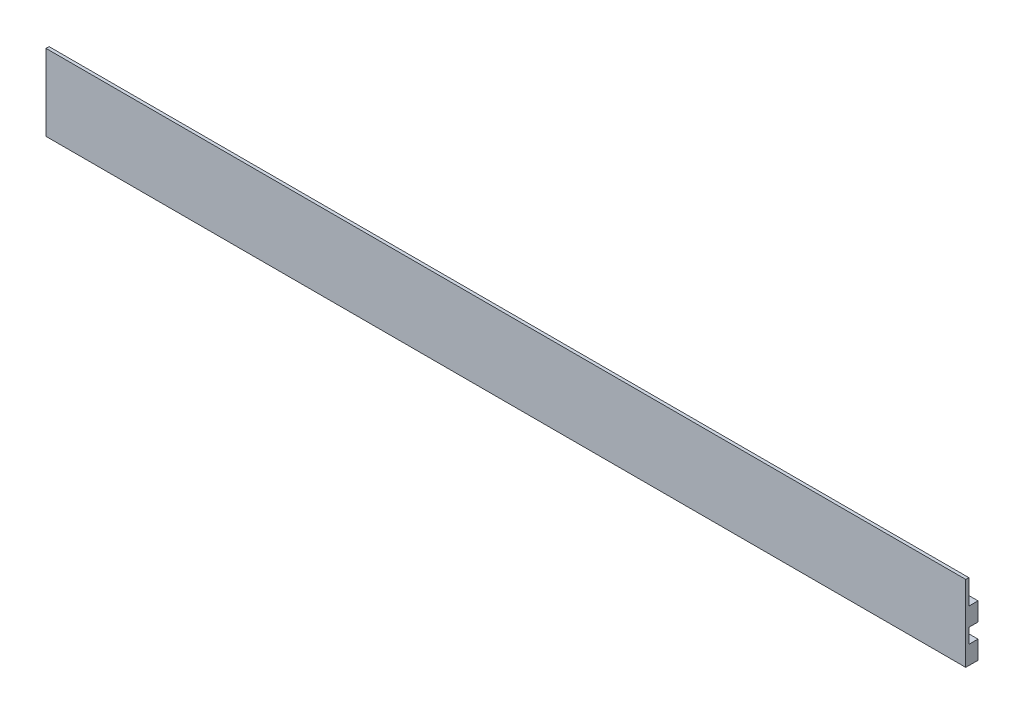
ISO-10303-21;
HEADER;
FILE_DESCRIPTION(('STEP AP214'),'2;1');
FILE_NAME('part.step','',(''),(''),'','','');
FILE_SCHEMA(('AUTOMOTIVE_DESIGN { 1 0 10303 214 1 1 1 1 }'));
ENDSEC;
DATA;
#1=APPLICATION_CONTEXT('core data for automotive mechanical design processes');
#2=APPLICATION_PROTOCOL_DEFINITION('international standard','automotive_design',2000,#1);
#3=PRODUCT_CONTEXT('',#1,'mechanical');
#4=PRODUCT('Part','Part','',(#3));
#5=PRODUCT_RELATED_PRODUCT_CATEGORY('part','',(#4));
#6=PRODUCT_DEFINITION_FORMATION('','',#4);
#7=PRODUCT_DEFINITION_CONTEXT('part definition',#1,'design');
#8=PRODUCT_DEFINITION('design','',#6,#7);
#9=PRODUCT_DEFINITION_SHAPE('','',#8);
#10=(LENGTH_UNIT() NAMED_UNIT(*) SI_UNIT(.MILLI.,.METRE.));
#11=(NAMED_UNIT(*) PLANE_ANGLE_UNIT() SI_UNIT($,.RADIAN.));
#12=(NAMED_UNIT(*) SI_UNIT($,.STERADIAN.) SOLID_ANGLE_UNIT());
#13=UNCERTAINTY_MEASURE_WITH_UNIT(LENGTH_MEASURE(1.E-05),#10,'distance_accuracy_value','');
#14=(GEOMETRIC_REPRESENTATION_CONTEXT(3) GLOBAL_UNCERTAINTY_ASSIGNED_CONTEXT((#13)) GLOBAL_UNIT_ASSIGNED_CONTEXT((#10,
#11,#12)) REPRESENTATION_CONTEXT('',''));
#15=CARTESIAN_POINT('',(0.,0.,0.));
#16=DIRECTION('',(0.,0.,1.));
#17=DIRECTION('',(1.,0.,0.));
#18=AXIS2_PLACEMENT_3D('',#15,#16,#17);
#19=CARTESIAN_POINT('',(0.,0.,-5.));
#20=DIRECTION('',(0.,0.,1.));
#21=DIRECTION('',(1.,0.,0.));
#22=AXIS2_PLACEMENT_3D('',#19,#20,#21);
#23=PLANE('',#22);
#24=DIRECTION('',(1.,0.,0.));
#25=VECTOR('',#24,1.);
#26=CARTESIAN_POINT('',(-1500.,361.346620116079,-5.));
#27=LINE('',#26,#25);
#28=CARTESIAN_POINT('',(-1500.,361.346620116079,-5.));
#29=VERTEX_POINT('',#28);
#30=CARTESIAN_POINT('',(1500.,361.346620116078,-5.));
#31=VERTEX_POINT('',#30);
#32=EDGE_CURVE('E133',#29,#31,#27,.T.);
#33=ORIENTED_EDGE('',*,*,#32,.F.);
#34=DIRECTION('',(0.,-1.,0.));
#35=VECTOR('',#34,1.);
#36=CARTESIAN_POINT('',(-1500.,-550.,-5.));
#37=LINE('',#36,#35);
#38=CARTESIAN_POINT('',(-1500.,409.471551706816,-5.));
#39=VERTEX_POINT('',#38);
#40=EDGE_CURVE('E153',#39,#29,#37,.T.);
#41=ORIENTED_EDGE('',*,*,#40,.F.);
#42=DIRECTION('',(-1.,0.,0.));
#43=VECTOR('',#42,1.);
#44=CARTESIAN_POINT('',(-1500.,409.471551706816,-5.));
#45=LINE('',#44,#43);
#46=CARTESIAN_POINT('',(1500.,409.471551706815,-5.));
#47=VERTEX_POINT('',#46);
#48=EDGE_CURVE('E164',#47,#39,#45,.T.);
#49=ORIENTED_EDGE('',*,*,#48,.F.);
#50=DIRECTION('',(0.,1.,0.));
#51=VECTOR('',#50,1.);
#52=CARTESIAN_POINT('',(1500.,-550.,-5.));
#53=LINE('',#52,#51);
#54=EDGE_CURVE('E143',#31,#47,#53,.T.);
#55=ORIENTED_EDGE('',*,*,#54,.F.);
#56=EDGE_LOOP('',(#33,#41,#49,#55));
#57=FACE_BOUND('',#56,.T.);
#58=ADVANCED_FACE('F37',(#57),#23,.F.);
#59=DIRECTION('',(1.,0.,0.));
#60=VECTOR('',#59,1.);
#61=CARTESIAN_POINT('',(-1500.,469.471551706816,-5.));
#62=LINE('',#61,#60);
#63=CARTESIAN_POINT('',(-1500.,469.471551706815,-5.));
#64=VERTEX_POINT('',#63);
#65=CARTESIAN_POINT('',(1500.,469.471551706815,-5.));
#66=VERTEX_POINT('',#65);
#67=EDGE_CURVE('E159',#64,#66,#62,.T.);
#68=ORIENTED_EDGE('',*,*,#67,.F.);
#69=CARTESIAN_POINT('',(-1500.,550.,-5.));
#70=VERTEX_POINT('',#69);
#71=EDGE_CURVE('E150',#70,#64,#37,.T.);
#72=ORIENTED_EDGE('',*,*,#71,.F.);
#73=DIRECTION('',(-1.,0.,0.));
#74=VECTOR('',#73,1.);
#75=CARTESIAN_POINT('',(1500.,550.,-5.));
#76=LINE('',#75,#74);
#77=CARTESIAN_POINT('',(1500.,550.,-5.));
#78=VERTEX_POINT('',#77);
#79=EDGE_CURVE('E140',#78,#70,#76,.T.);
#80=ORIENTED_EDGE('',*,*,#79,.F.);
#81=EDGE_CURVE('E60',#66,#78,#53,.T.);
#82=ORIENTED_EDGE('',*,*,#81,.F.);
#83=EDGE_LOOP('',(#68,#72,#80,#82));
#84=FACE_BOUND('',#83,.T.);
#85=ADVANCED_FACE('F158',(#84),#23,.F.);
#86=CARTESIAN_POINT('',(-1500.,-550.,5.));
#87=DIRECTION('',(1.,0.,0.));
#88=DIRECTION('',(0.,0.,-1.));
#89=AXIS2_PLACEMENT_3D('',#86,#87,#88);
#90=PLANE('',#89);
#91=DIRECTION('',(0.,0.,1.));
#92=VECTOR('',#91,1.);
#93=CARTESIAN_POINT('',(-1500.,301.346620116079,-35.));
#94=LINE('',#93,#92);
#95=CARTESIAN_POINT('',(-1500.,301.346620116079,-35.));
#96=VERTEX_POINT('',#95);
#97=CARTESIAN_POINT('',(-1500.,301.346620116079,5.));
#98=VERTEX_POINT('',#97);
#99=EDGE_CURVE('E116',#96,#98,#94,.T.);
#100=ORIENTED_EDGE('',*,*,#99,.T.);
#101=DIRECTION('',(0.,-1.,0.));
#102=VECTOR('',#101,1.);
#103=CARTESIAN_POINT('',(-1500.,-550.,5.));
#104=LINE('',#103,#102);
#105=CARTESIAN_POINT('',(-1500.,550.,5.));
#106=VERTEX_POINT('',#105);
#107=EDGE_CURVE('E120',#106,#98,#104,.T.);
#108=ORIENTED_EDGE('',*,*,#107,.F.);
#109=DIRECTION('',(0.,0.,-1.));
#110=VECTOR('',#109,1.);
#111=CARTESIAN_POINT('',(-1500.,550.,5.));
#112=LINE('',#111,#110);
#113=EDGE_CURVE('E45',#106,#70,#112,.T.);
#114=ORIENTED_EDGE('',*,*,#113,.T.);
#115=ORIENTED_EDGE('',*,*,#71,.T.);
#116=DIRECTION('',(0.,0.,1.));
#117=VECTOR('',#116,1.);
#118=CARTESIAN_POINT('',(-1500.,469.471551706816,-35.));
#119=LINE('',#118,#117);
#120=CARTESIAN_POINT('',(-1500.,469.471551706816,-35.));
#121=VERTEX_POINT('',#120);
#122=EDGE_CURVE('E175',#121,#64,#119,.T.);
#123=ORIENTED_EDGE('',*,*,#122,.F.);
#124=DIRECTION('',(0.,1.,0.));
#125=VECTOR('',#124,1.);
#126=CARTESIAN_POINT('',(-1500.,469.471551706816,-35.));
#127=LINE('',#126,#125);
#128=CARTESIAN_POINT('',(-1500.,409.471551706816,-35.));
#129=VERTEX_POINT('',#128);
#130=EDGE_CURVE('E191',#129,#121,#127,.T.);
#131=ORIENTED_EDGE('',*,*,#130,.F.);
#132=DIRECTION('',(0.,0.,1.));
#133=VECTOR('',#132,1.);
#134=CARTESIAN_POINT('',(-1500.,409.471551706816,-35.));
#135=LINE('',#134,#133);
#136=EDGE_CURVE('E177',#129,#39,#135,.T.);
#137=ORIENTED_EDGE('',*,*,#136,.T.);
#138=ORIENTED_EDGE('',*,*,#40,.T.);
#139=DIRECTION('',(0.,0.,1.));
#140=VECTOR('',#139,1.);
#141=CARTESIAN_POINT('',(-1500.,361.346620116079,-35.));
#142=LINE('',#141,#140);
#143=CARTESIAN_POINT('',(-1500.,361.346620116079,-35.));
#144=VERTEX_POINT('',#143);
#145=EDGE_CURVE('E125',#144,#29,#142,.T.);
#146=ORIENTED_EDGE('',*,*,#145,.F.);
#147=DIRECTION('',(0.,1.,0.));
#148=VECTOR('',#147,1.);
#149=CARTESIAN_POINT('',(-1500.,361.346620116079,-35.));
#150=LINE('',#149,#148);
#151=EDGE_CURVE('E122',#96,#144,#150,.T.);
#152=ORIENTED_EDGE('',*,*,#151,.F.);
#153=EDGE_LOOP('',(#100,#108,#114,#115,#123,#131,#137,#138,#146,#152));
#154=FACE_BOUND('',#153,.T.);
#155=ADVANCED_FACE('F39',(#154),#90,.F.);
#156=CARTESIAN_POINT('',(1500.,-550.,5.));
#157=DIRECTION('',(-1.,0.,0.));
#158=DIRECTION('',(0.,0.,1.));
#159=AXIS2_PLACEMENT_3D('',#156,#157,#158);
#160=PLANE('',#159);
#161=DIRECTION('',(0.,1.,0.));
#162=VECTOR('',#161,1.);
#163=CARTESIAN_POINT('',(1500.,-550.,5.));
#164=LINE('',#163,#162);
#165=CARTESIAN_POINT('',(1500.,301.346620116078,5.));
#166=VERTEX_POINT('',#165);
#167=CARTESIAN_POINT('',(1500.,550.,5.));
#168=VERTEX_POINT('',#167);
#169=EDGE_CURVE('E139',#166,#168,#164,.T.);
#170=ORIENTED_EDGE('',*,*,#169,.F.);
#171=DIRECTION('',(0.,0.,1.));
#172=VECTOR('',#171,1.);
#173=CARTESIAN_POINT('',(1500.,301.346620116078,-35.));
#174=LINE('',#173,#172);
#175=CARTESIAN_POINT('',(1500.,301.346620116078,-35.));
#176=VERTEX_POINT('',#175);
#177=EDGE_CURVE('E124',#176,#166,#174,.T.);
#178=ORIENTED_EDGE('',*,*,#177,.F.);
#179=DIRECTION('',(0.,-1.,0.));
#180=VECTOR('',#179,1.);
#181=CARTESIAN_POINT('',(1500.,361.346620116078,-35.));
#182=LINE('',#181,#180);
#183=CARTESIAN_POINT('',(1500.,361.346620116078,-35.));
#184=VERTEX_POINT('',#183);
#185=EDGE_CURVE('E202',#184,#176,#182,.T.);
#186=ORIENTED_EDGE('',*,*,#185,.F.);
#187=DIRECTION('',(0.,0.,1.));
#188=VECTOR('',#187,1.);
#189=CARTESIAN_POINT('',(1500.,361.346620116078,-35.));
#190=LINE('',#189,#188);
#191=EDGE_CURVE('E52',#184,#31,#190,.T.);
#192=ORIENTED_EDGE('',*,*,#191,.T.);
#193=ORIENTED_EDGE('',*,*,#54,.T.);
#194=DIRECTION('',(0.,0.,1.));
#195=VECTOR('',#194,1.);
#196=CARTESIAN_POINT('',(1500.,409.471551706815,-35.));
#197=LINE('',#196,#195);
#198=CARTESIAN_POINT('',(1500.,409.471551706815,-35.));
#199=VERTEX_POINT('',#198);
#200=EDGE_CURVE('E146',#199,#47,#197,.T.);
#201=ORIENTED_EDGE('',*,*,#200,.F.);
#202=DIRECTION('',(0.,-1.,0.));
#203=VECTOR('',#202,1.);
#204=CARTESIAN_POINT('',(1500.,469.471551706815,-35.));
#205=LINE('',#204,#203);
#206=CARTESIAN_POINT('',(1500.,469.471551706815,-35.));
#207=VERTEX_POINT('',#206);
#208=EDGE_CURVE('E163',#207,#199,#205,.T.);
#209=ORIENTED_EDGE('',*,*,#208,.F.);
#210=DIRECTION('',(0.,0.,1.));
#211=VECTOR('',#210,1.);
#212=CARTESIAN_POINT('',(1500.,469.471551706815,-35.));
#213=LINE('',#212,#211);
#214=EDGE_CURVE('E173',#207,#66,#213,.T.);
#215=ORIENTED_EDGE('',*,*,#214,.T.);
#216=ORIENTED_EDGE('',*,*,#81,.T.);
#217=DIRECTION('',(0.,0.,-1.));
#218=VECTOR('',#217,1.);
#219=CARTESIAN_POINT('',(1500.,550.,5.));
#220=LINE('',#219,#218);
#221=EDGE_CURVE('E11',#168,#78,#220,.T.);
#222=ORIENTED_EDGE('',*,*,#221,.F.);
#223=EDGE_LOOP('',(#170,#178,#186,#192,#193,#201,#209,#215,#216,#222));
#224=FACE_BOUND('',#223,.T.);
#225=ADVANCED_FACE('F210',(#224),#160,.F.);
#226=CARTESIAN_POINT('',(1500.,550.,5.));
#227=DIRECTION('',(0.,-1.,0.));
#228=DIRECTION('',(1.,0.,0.));
#229=AXIS2_PLACEMENT_3D('',#226,#227,#228);
#230=PLANE('',#229);
#231=ORIENTED_EDGE('',*,*,#79,.T.);
#232=ORIENTED_EDGE('',*,*,#113,.F.);
#233=DIRECTION('',(-1.,0.,0.));
#234=VECTOR('',#233,1.);
#235=CARTESIAN_POINT('',(1500.,550.,5.));
#236=LINE('',#235,#234);
#237=EDGE_CURVE('E137',#168,#106,#236,.T.);
#238=ORIENTED_EDGE('',*,*,#237,.F.);
#239=ORIENTED_EDGE('',*,*,#221,.T.);
#240=EDGE_LOOP('',(#231,#232,#238,#239));
#241=FACE_BOUND('',#240,.T.);
#242=ADVANCED_FACE('F212',(#241),#230,.F.);
#243=CARTESIAN_POINT('',(0.,0.,5.));
#244=DIRECTION('',(0.,0.,1.));
#245=DIRECTION('',(1.,0.,0.));
#246=AXIS2_PLACEMENT_3D('',#243,#244,#245);
#247=PLANE('',#246);
#248=DIRECTION('',(1.,0.,0.));
#249=VECTOR('',#248,1.);
#250=CARTESIAN_POINT('',(-1500.,301.346620116079,5.));
#251=LINE('',#250,#249);
#252=EDGE_CURVE('E128',#98,#166,#251,.T.);
#253=ORIENTED_EDGE('',*,*,#252,.T.);
#254=ORIENTED_EDGE('',*,*,#169,.T.);
#255=ORIENTED_EDGE('',*,*,#237,.T.);
#256=ORIENTED_EDGE('',*,*,#107,.T.);
#257=EDGE_LOOP('',(#253,#254,#255,#256));
#258=FACE_BOUND('',#257,.T.);
#259=ADVANCED_FACE('F135',(#258),#247,.T.);
#260=CARTESIAN_POINT('',(-1500.,409.471551706816,-35.));
#261=DIRECTION('',(0.,1.,0.));
#262=DIRECTION('',(-1.,0.,0.));
#263=AXIS2_PLACEMENT_3D('',#260,#261,#262);
#264=PLANE('',#263);
#265=ORIENTED_EDGE('',*,*,#48,.T.);
#266=ORIENTED_EDGE('',*,*,#136,.F.);
#267=DIRECTION('',(-1.,0.,0.));
#268=VECTOR('',#267,1.);
#269=CARTESIAN_POINT('',(-1500.,409.471551706816,-35.));
#270=LINE('',#269,#268);
#271=EDGE_CURVE('E167',#199,#129,#270,.T.);
#272=ORIENTED_EDGE('',*,*,#271,.F.);
#273=ORIENTED_EDGE('',*,*,#200,.T.);
#274=EDGE_LOOP('',(#265,#266,#272,#273));
#275=FACE_BOUND('',#274,.T.);
#276=ADVANCED_FACE('F190',(#275),#264,.F.);
#277=CARTESIAN_POINT('',(-1500.,469.471551706816,-35.));
#278=DIRECTION('',(0.,-1.,0.));
#279=DIRECTION('',(1.,0.,0.));
#280=AXIS2_PLACEMENT_3D('',#277,#278,#279);
#281=PLANE('',#280);
#282=ORIENTED_EDGE('',*,*,#67,.T.);
#283=ORIENTED_EDGE('',*,*,#214,.F.);
#284=DIRECTION('',(1.,0.,0.));
#285=VECTOR('',#284,1.);
#286=CARTESIAN_POINT('',(-1500.,469.471551706816,-35.));
#287=LINE('',#286,#285);
#288=EDGE_CURVE('E176',#121,#207,#287,.T.);
#289=ORIENTED_EDGE('',*,*,#288,.F.);
#290=ORIENTED_EDGE('',*,*,#122,.T.);
#291=EDGE_LOOP('',(#282,#283,#289,#290));
#292=FACE_BOUND('',#291,.T.);
#293=ADVANCED_FACE('F230',(#292),#281,.F.);
#294=CARTESIAN_POINT('',(0.,0.,-35.));
#295=DIRECTION('',(0.,0.,1.));
#296=DIRECTION('',(1.,0.,0.));
#297=AXIS2_PLACEMENT_3D('',#294,#295,#296);
#298=PLANE('',#297);
#299=ORIENTED_EDGE('',*,*,#208,.T.);
#300=ORIENTED_EDGE('',*,*,#271,.T.);
#301=ORIENTED_EDGE('',*,*,#130,.T.);
#302=ORIENTED_EDGE('',*,*,#288,.T.);
#303=EDGE_LOOP('',(#299,#300,#301,#302));
#304=FACE_BOUND('',#303,.T.);
#305=ADVANCED_FACE('F233',(#304),#298,.F.);
#306=CARTESIAN_POINT('',(-1500.,301.346620116079,-35.));
#307=DIRECTION('',(0.,1.,0.));
#308=DIRECTION('',(-1.,0.,0.));
#309=AXIS2_PLACEMENT_3D('',#306,#307,#308);
#310=PLANE('',#309);
#311=ORIENTED_EDGE('',*,*,#177,.T.);
#312=ORIENTED_EDGE('',*,*,#252,.F.);
#313=ORIENTED_EDGE('',*,*,#99,.F.);
#314=DIRECTION('',(-1.,0.,0.));
#315=VECTOR('',#314,1.);
#316=CARTESIAN_POINT('',(-1500.,301.346620116079,-35.));
#317=LINE('',#316,#315);
#318=EDGE_CURVE('E205',#176,#96,#317,.T.);
#319=ORIENTED_EDGE('',*,*,#318,.F.);
#320=EDGE_LOOP('',(#311,#312,#313,#319));
#321=FACE_BOUND('',#320,.T.);
#322=ADVANCED_FACE('F129',(#321),#310,.F.);
#323=CARTESIAN_POINT('',(-1500.,361.346620116079,-35.));
#324=DIRECTION('',(0.,-1.,0.));
#325=DIRECTION('',(1.,0.,0.));
#326=AXIS2_PLACEMENT_3D('',#323,#324,#325);
#327=PLANE('',#326);
#328=ORIENTED_EDGE('',*,*,#32,.T.);
#329=ORIENTED_EDGE('',*,*,#191,.F.);
#330=DIRECTION('',(1.,0.,0.));
#331=VECTOR('',#330,1.);
#332=CARTESIAN_POINT('',(-1500.,361.346620116079,-35.));
#333=LINE('',#332,#331);
#334=EDGE_CURVE('E200',#144,#184,#333,.T.);
#335=ORIENTED_EDGE('',*,*,#334,.F.);
#336=ORIENTED_EDGE('',*,*,#145,.T.);
#337=EDGE_LOOP('',(#328,#329,#335,#336));
#338=FACE_BOUND('',#337,.T.);
#339=ADVANCED_FACE('F238',(#338),#327,.F.);
#340=CARTESIAN_POINT('',(0.,0.,-35.));
#341=DIRECTION('',(0.,0.,1.));
#342=DIRECTION('',(1.,0.,0.));
#343=AXIS2_PLACEMENT_3D('',#340,#341,#342);
#344=PLANE('',#343);
#345=ORIENTED_EDGE('',*,*,#185,.T.);
#346=ORIENTED_EDGE('',*,*,#318,.T.);
#347=ORIENTED_EDGE('',*,*,#151,.T.);
#348=ORIENTED_EDGE('',*,*,#334,.T.);
#349=EDGE_LOOP('',(#345,#346,#347,#348));
#350=FACE_BOUND('',#349,.T.);
#351=ADVANCED_FACE('F209',(#350),#344,.F.);
#352=CLOSED_SHELL('',(#58,#85,#155,#225,#242,#259,#276,#293,#305,#322,#339,#351));
#353=MANIFOLD_SOLID_BREP('B2',#352);
#354=ADVANCED_BREP_SHAPE_REPRESENTATION('',(#18,#353),#14);
#355=SHAPE_DEFINITION_REPRESENTATION(#9,#354);
ENDSEC;
END-ISO-10303-21;
